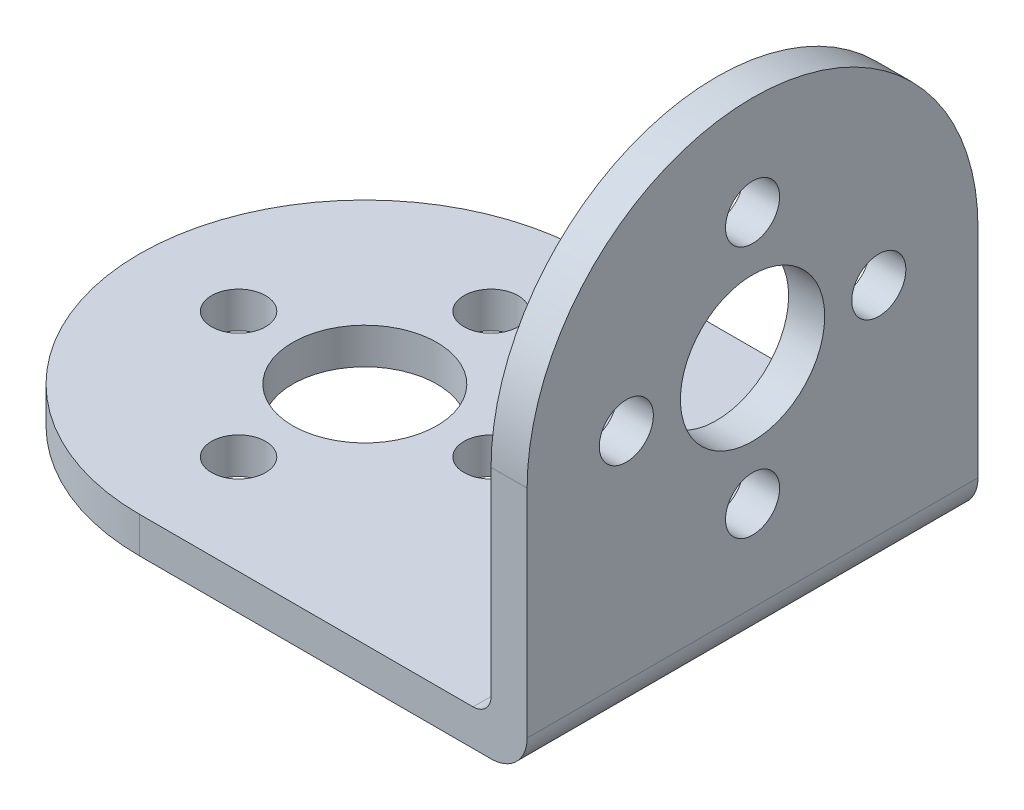
ISO-10303-21;
HEADER;
FILE_DESCRIPTION(('STEP AP214'),'2;1');
FILE_NAME('part.step','',(''),(''),'','','');
FILE_SCHEMA(('AUTOMOTIVE_DESIGN { 1 0 10303 214 1 1 1 1 }'));
ENDSEC;
DATA;
#1=APPLICATION_CONTEXT('core data for automotive mechanical design processes');
#2=APPLICATION_PROTOCOL_DEFINITION('international standard','automotive_design',2000,#1);
#3=PRODUCT_CONTEXT('',#1,'mechanical');
#4=PRODUCT('Part','Part','',(#3));
#5=PRODUCT_RELATED_PRODUCT_CATEGORY('part','',(#4));
#6=PRODUCT_DEFINITION_FORMATION('','',#4);
#7=PRODUCT_DEFINITION_CONTEXT('part definition',#1,'design');
#8=PRODUCT_DEFINITION('design','',#6,#7);
#9=PRODUCT_DEFINITION_SHAPE('','',#8);
#10=(LENGTH_UNIT() NAMED_UNIT(*) SI_UNIT(.MILLI.,.METRE.));
#11=(NAMED_UNIT(*) PLANE_ANGLE_UNIT() SI_UNIT($,.RADIAN.));
#12=(NAMED_UNIT(*) SI_UNIT($,.STERADIAN.) SOLID_ANGLE_UNIT());
#13=UNCERTAINTY_MEASURE_WITH_UNIT(LENGTH_MEASURE(1.E-05),#10,'distance_accuracy_value','');
#14=(GEOMETRIC_REPRESENTATION_CONTEXT(3) GLOBAL_UNCERTAINTY_ASSIGNED_CONTEXT((#13)) GLOBAL_UNIT_ASSIGNED_CONTEXT((#10,
#11,#12)) REPRESENTATION_CONTEXT('',''));
#15=CARTESIAN_POINT('',(0.,0.,0.));
#16=DIRECTION('',(0.,0.,1.));
#17=DIRECTION('',(1.,0.,0.));
#18=AXIS2_PLACEMENT_3D('',#15,#16,#17);
#19=CARTESIAN_POINT('',(-19.5,2.,0.));
#20=DIRECTION('',(0.,1.,0.));
#21=DIRECTION('',(0.,0.,1.));
#22=AXIS2_PLACEMENT_3D('',#19,#20,#21);
#23=PLANE('',#22);
#24=CARTESIAN_POINT('',(-12.5,2.,0.));
#25=DIRECTION('',(0.,1.,0.));
#26=DIRECTION('',(0.,0.,1.));
#27=AXIS2_PLACEMENT_3D('',#24,#25,#26);
#28=CIRCLE('',#27,1.5);
#29=CARTESIAN_POINT('',(-12.5,2.,1.50000000000001));
#30=VERTEX_POINT('',#29);
#31=EDGE_CURVE('E140',#30,#30,#28,.T.);
#32=ORIENTED_EDGE('',*,*,#31,.F.);
#33=EDGE_LOOP('',(#32));
#34=FACE_BOUND('',#33,.T.);
#35=CARTESIAN_POINT('',(-19.5,2.,-6.99999999999999));
#36=DIRECTION('',(0.,1.,0.));
#37=DIRECTION('',(0.,0.,1.));
#38=AXIS2_PLACEMENT_3D('',#35,#36,#37);
#39=CIRCLE('',#38,1.5);
#40=CARTESIAN_POINT('',(-19.5,2.,-5.49999999999999));
#41=VERTEX_POINT('',#40);
#42=EDGE_CURVE('E152',#41,#41,#39,.T.);
#43=ORIENTED_EDGE('',*,*,#42,.F.);
#44=EDGE_LOOP('',(#43));
#45=FACE_BOUND('',#44,.T.);
#46=DIRECTION('',(1.,0.,0.));
#47=VECTOR('',#46,1.);
#48=CARTESIAN_POINT('',(-19.5,2.,12.5));
#49=LINE('',#48,#47);
#50=CARTESIAN_POINT('',(-19.5,2.,12.5));
#51=VERTEX_POINT('',#50);
#52=CARTESIAN_POINT('',(-1.,2.,12.5));
#53=VERTEX_POINT('',#52);
#54=EDGE_CURVE('E167',#51,#53,#49,.T.);
#55=ORIENTED_EDGE('',*,*,#54,.T.);
#56=DIRECTION('',(0.,0.,-1.));
#57=VECTOR('',#56,1.);
#58=CARTESIAN_POINT('',(-1.,2.,-12.5));
#59=LINE('',#58,#57);
#60=CARTESIAN_POINT('',(-1.,2.,-12.5));
#61=VERTEX_POINT('',#60);
#62=EDGE_CURVE('E184',#53,#61,#59,.T.);
#63=ORIENTED_EDGE('',*,*,#62,.T.);
#64=DIRECTION('',(-1.,0.,0.));
#65=VECTOR('',#64,1.);
#66=CARTESIAN_POINT('',(-19.5,2.,-12.5));
#67=LINE('',#66,#65);
#68=CARTESIAN_POINT('',(-19.5,2.,-12.5));
#69=VERTEX_POINT('',#68);
#70=EDGE_CURVE('E171',#61,#69,#67,.T.);
#71=ORIENTED_EDGE('',*,*,#70,.T.);
#72=CARTESIAN_POINT('',(-19.5,2.,0.));
#73=DIRECTION('',(0.,1.,0.));
#74=DIRECTION('',(0.,0.,1.));
#75=AXIS2_PLACEMENT_3D('',#72,#73,#74);
#76=CIRCLE('',#75,12.5);
#77=EDGE_CURVE('E164',#69,#51,#76,.T.);
#78=ORIENTED_EDGE('',*,*,#77,.T.);
#79=EDGE_LOOP('',(#55,#63,#71,#78));
#80=FACE_BOUND('',#79,.T.);
#81=CARTESIAN_POINT('',(-19.5,2.,0.));
#82=DIRECTION('',(0.,1.,0.));
#83=DIRECTION('',(0.,0.,1.));
#84=AXIS2_PLACEMENT_3D('',#81,#82,#83);
#85=CIRCLE('',#84,4.);
#86=CARTESIAN_POINT('',(-19.5,2.,4.));
#87=VERTEX_POINT('',#86);
#88=EDGE_CURVE('E158',#87,#87,#85,.T.);
#89=ORIENTED_EDGE('',*,*,#88,.F.);
#90=EDGE_LOOP('',(#89));
#91=FACE_BOUND('',#90,.T.);
#92=CARTESIAN_POINT('',(-19.5,2.,7.00000000000001));
#93=DIRECTION('',(0.,1.,0.));
#94=DIRECTION('',(0.,0.,1.));
#95=AXIS2_PLACEMENT_3D('',#92,#93,#94);
#96=CIRCLE('',#95,1.5);
#97=CARTESIAN_POINT('',(-19.5,2.,8.50000000000001));
#98=VERTEX_POINT('',#97);
#99=EDGE_CURVE('E146',#98,#98,#96,.T.);
#100=ORIENTED_EDGE('',*,*,#99,.F.);
#101=EDGE_LOOP('',(#100));
#102=FACE_BOUND('',#101,.T.);
#103=CARTESIAN_POINT('',(-26.5,2.,0.));
#104=DIRECTION('',(0.,1.,0.));
#105=DIRECTION('',(0.,0.,1.));
#106=AXIS2_PLACEMENT_3D('',#103,#104,#105);
#107=CIRCLE('',#106,1.5);
#108=CARTESIAN_POINT('',(-26.5,2.,1.50000000000001));
#109=VERTEX_POINT('',#108);
#110=EDGE_CURVE('E134',#109,#109,#107,.T.);
#111=ORIENTED_EDGE('',*,*,#110,.F.);
#112=EDGE_LOOP('',(#111));
#113=FACE_BOUND('',#112,.T.);
#114=ADVANCED_FACE('F36',(#34,#45,#80,#91,#102,#113),#23,.T.);
#115=CARTESIAN_POINT('',(-19.5,0.,0.));
#116=DIRECTION('',(0.,1.,0.));
#117=DIRECTION('',(0.,0.,1.));
#118=AXIS2_PLACEMENT_3D('',#115,#116,#117);
#119=PLANE('',#118);
#120=DIRECTION('',(-1.,0.,0.));
#121=VECTOR('',#120,1.);
#122=CARTESIAN_POINT('',(-19.5,0.,-12.5));
#123=LINE('',#122,#121);
#124=CARTESIAN_POINT('',(0.,0.,-12.5));
#125=VERTEX_POINT('',#124);
#126=CARTESIAN_POINT('',(-19.5,0.,-12.5));
#127=VERTEX_POINT('',#126);
#128=EDGE_CURVE('E168',#125,#127,#123,.T.);
#129=ORIENTED_EDGE('',*,*,#128,.F.);
#130=DIRECTION('',(0.,0.,-1.));
#131=VECTOR('',#130,1.);
#132=CARTESIAN_POINT('',(0.,0.,0.));
#133=LINE('',#132,#131);
#134=CARTESIAN_POINT('',(0.,0.,12.5));
#135=VERTEX_POINT('',#134);
#136=EDGE_CURVE('E44',#125,#135,#133,.F.);
#137=ORIENTED_EDGE('',*,*,#136,.T.);
#138=DIRECTION('',(1.,0.,0.));
#139=VECTOR('',#138,1.);
#140=CARTESIAN_POINT('',(-19.5,0.,12.5));
#141=LINE('',#140,#139);
#142=CARTESIAN_POINT('',(-19.5,0.,12.5));
#143=VERTEX_POINT('',#142);
#144=EDGE_CURVE('E176',#143,#135,#141,.T.);
#145=ORIENTED_EDGE('',*,*,#144,.F.);
#146=CARTESIAN_POINT('',(-19.5,0.,0.));
#147=DIRECTION('',(0.,1.,0.));
#148=DIRECTION('',(0.,0.,1.));
#149=AXIS2_PLACEMENT_3D('',#146,#147,#148);
#150=CIRCLE('',#149,12.5);
#151=EDGE_CURVE('E161',#127,#143,#150,.T.);
#152=ORIENTED_EDGE('',*,*,#151,.F.);
#153=EDGE_LOOP('',(#129,#137,#145,#152));
#154=FACE_BOUND('',#153,.T.);
#155=CARTESIAN_POINT('',(-19.5,0.,0.));
#156=DIRECTION('',(0.,1.,0.));
#157=DIRECTION('',(0.,0.,1.));
#158=AXIS2_PLACEMENT_3D('',#155,#156,#157);
#159=CIRCLE('',#158,4.);
#160=CARTESIAN_POINT('',(-19.5,0.,4.));
#161=VERTEX_POINT('',#160);
#162=EDGE_CURVE('E155',#161,#161,#159,.T.);
#163=ORIENTED_EDGE('',*,*,#162,.T.);
#164=EDGE_LOOP('',(#163));
#165=FACE_BOUND('',#164,.T.);
#166=CARTESIAN_POINT('',(-19.5,0.,-6.99999999999999));
#167=DIRECTION('',(0.,1.,0.));
#168=DIRECTION('',(0.,0.,1.));
#169=AXIS2_PLACEMENT_3D('',#166,#167,#168);
#170=CIRCLE('',#169,1.5);
#171=CARTESIAN_POINT('',(-19.5,0.,-5.49999999999999));
#172=VERTEX_POINT('',#171);
#173=EDGE_CURVE('E149',#172,#172,#170,.T.);
#174=ORIENTED_EDGE('',*,*,#173,.T.);
#175=EDGE_LOOP('',(#174));
#176=FACE_BOUND('',#175,.T.);
#177=CARTESIAN_POINT('',(-19.5,0.,7.00000000000001));
#178=DIRECTION('',(0.,1.,0.));
#179=DIRECTION('',(0.,0.,1.));
#180=AXIS2_PLACEMENT_3D('',#177,#178,#179);
#181=CIRCLE('',#180,1.5);
#182=CARTESIAN_POINT('',(-19.5,0.,8.50000000000001));
#183=VERTEX_POINT('',#182);
#184=EDGE_CURVE('E143',#183,#183,#181,.T.);
#185=ORIENTED_EDGE('',*,*,#184,.T.);
#186=EDGE_LOOP('',(#185));
#187=FACE_BOUND('',#186,.T.);
#188=CARTESIAN_POINT('',(-12.5,0.,0.));
#189=DIRECTION('',(0.,1.,0.));
#190=DIRECTION('',(0.,0.,1.));
#191=AXIS2_PLACEMENT_3D('',#188,#189,#190);
#192=CIRCLE('',#191,1.5);
#193=CARTESIAN_POINT('',(-12.5,0.,1.50000000000001));
#194=VERTEX_POINT('',#193);
#195=EDGE_CURVE('E137',#194,#194,#192,.T.);
#196=ORIENTED_EDGE('',*,*,#195,.T.);
#197=EDGE_LOOP('',(#196));
#198=FACE_BOUND('',#197,.T.);
#199=CARTESIAN_POINT('',(-26.5,0.,0.));
#200=DIRECTION('',(0.,1.,0.));
#201=DIRECTION('',(0.,0.,1.));
#202=AXIS2_PLACEMENT_3D('',#199,#200,#201);
#203=CIRCLE('',#202,1.5);
#204=CARTESIAN_POINT('',(-26.5,0.,1.50000000000001));
#205=VERTEX_POINT('',#204);
#206=EDGE_CURVE('E117',#205,#205,#203,.T.);
#207=ORIENTED_EDGE('',*,*,#206,.T.);
#208=EDGE_LOOP('',(#207));
#209=FACE_BOUND('',#208,.T.);
#210=ADVANCED_FACE('F258',(#154,#165,#176,#187,#198,#209),#119,.F.);
#211=CARTESIAN_POINT('',(-19.5,2.,0.));
#212=DIRECTION('',(0.,-1.,0.));
#213=DIRECTION('',(0.,0.,-1.));
#214=AXIS2_PLACEMENT_3D('',#211,#212,#213);
#215=CYLINDRICAL_SURFACE('',#214,12.5);
#216=ORIENTED_EDGE('',*,*,#151,.T.);
#217=DIRECTION('',(0.,-1.,0.));
#218=VECTOR('',#217,1.);
#219=CARTESIAN_POINT('',(-19.5,2.,12.5));
#220=LINE('',#219,#218);
#221=EDGE_CURVE('E181',#51,#143,#220,.T.);
#222=ORIENTED_EDGE('',*,*,#221,.F.);
#223=ORIENTED_EDGE('',*,*,#77,.F.);
#224=DIRECTION('',(0.,-1.,0.));
#225=VECTOR('',#224,1.);
#226=CARTESIAN_POINT('',(-19.5,2.,-12.5));
#227=LINE('',#226,#225);
#228=EDGE_CURVE('E173',#69,#127,#227,.T.);
#229=ORIENTED_EDGE('',*,*,#228,.T.);
#230=EDGE_LOOP('',(#216,#222,#223,#229));
#231=FACE_BOUND('',#230,.T.);
#232=ADVANCED_FACE('F264',(#231),#215,.T.);
#233=CARTESIAN_POINT('',(-19.5,2.,12.5));
#234=DIRECTION('',(0.,0.,-1.));
#235=DIRECTION('',(-1.,0.,0.));
#236=AXIS2_PLACEMENT_3D('',#233,#234,#235);
#237=PLANE('',#236);
#238=ORIENTED_EDGE('',*,*,#144,.T.);
#239=CARTESIAN_POINT('',(0.,2.,12.5));
#240=DIRECTION('',(0.,0.,-1.));
#241=DIRECTION('',(-1.,0.,0.));
#242=AXIS2_PLACEMENT_3D('',#239,#240,#241);
#243=CIRCLE('',#242,2.);
#244=CARTESIAN_POINT('',(2.,2.,12.5));
#245=VERTEX_POINT('',#244);
#246=EDGE_CURVE('E11',#135,#245,#243,.F.);
#247=ORIENTED_EDGE('',*,*,#246,.T.);
#248=DIRECTION('',(0.,-1.,0.));
#249=VECTOR('',#248,1.);
#250=CARTESIAN_POINT('',(2.,0.,12.5));
#251=LINE('',#250,#249);
#252=CARTESIAN_POINT('',(2.,14.,12.5));
#253=VERTEX_POINT('',#252);
#254=EDGE_CURVE('E108',#253,#245,#251,.T.);
#255=ORIENTED_EDGE('',*,*,#254,.F.);
#256=DIRECTION('',(-1.,0.,0.));
#257=VECTOR('',#256,1.);
#258=CARTESIAN_POINT('',(2.,14.,12.5));
#259=LINE('',#258,#257);
#260=CARTESIAN_POINT('',(0.,14.,12.5));
#261=VERTEX_POINT('',#260);
#262=EDGE_CURVE('E118',#253,#261,#259,.T.);
#263=ORIENTED_EDGE('',*,*,#262,.T.);
#264=DIRECTION('',(0.,-1.,0.));
#265=VECTOR('',#264,1.);
#266=CARTESIAN_POINT('',(0.,0.,12.5));
#267=LINE('',#266,#265);
#268=CARTESIAN_POINT('',(0.,3.,12.5));
#269=VERTEX_POINT('',#268);
#270=EDGE_CURVE('E127',#261,#269,#267,.T.);
#271=ORIENTED_EDGE('',*,*,#270,.T.);
#272=CARTESIAN_POINT('',(-1.,3.,12.5));
#273=DIRECTION('',(0.,0.,-1.));
#274=DIRECTION('',(-1.,0.,0.));
#275=AXIS2_PLACEMENT_3D('',#272,#273,#274);
#276=CIRCLE('',#275,1.);
#277=EDGE_CURVE('E191',#269,#53,#276,.T.);
#278=ORIENTED_EDGE('',*,*,#277,.T.);
#279=ORIENTED_EDGE('',*,*,#54,.F.);
#280=ORIENTED_EDGE('',*,*,#221,.T.);
#281=EDGE_LOOP('',(#238,#247,#255,#263,#271,#278,#279,#280));
#282=FACE_BOUND('',#281,.T.);
#283=ADVANCED_FACE('F196',(#282),#237,.F.);
#284=CARTESIAN_POINT('',(-19.5,2.,-12.5));
#285=DIRECTION('',(0.,0.,1.));
#286=DIRECTION('',(1.,0.,0.));
#287=AXIS2_PLACEMENT_3D('',#284,#285,#286);
#288=PLANE('',#287);
#289=DIRECTION('',(0.,1.,0.));
#290=VECTOR('',#289,1.);
#291=CARTESIAN_POINT('',(2.,0.,-12.5));
#292=LINE('',#291,#290);
#293=CARTESIAN_POINT('',(2.,2.,-12.5));
#294=VERTEX_POINT('',#293);
#295=CARTESIAN_POINT('',(2.,14.,-12.5));
#296=VERTEX_POINT('',#295);
#297=EDGE_CURVE('E98',#294,#296,#292,.T.);
#298=ORIENTED_EDGE('',*,*,#297,.F.);
#299=CARTESIAN_POINT('',(0.,2.,-12.5));
#300=DIRECTION('',(0.,0.,1.));
#301=DIRECTION('',(1.,0.,0.));
#302=AXIS2_PLACEMENT_3D('',#299,#300,#301);
#303=CIRCLE('',#302,2.);
#304=EDGE_CURVE('E58',#294,#125,#303,.F.);
#305=ORIENTED_EDGE('',*,*,#304,.T.);
#306=ORIENTED_EDGE('',*,*,#128,.T.);
#307=ORIENTED_EDGE('',*,*,#228,.F.);
#308=ORIENTED_EDGE('',*,*,#70,.F.);
#309=CARTESIAN_POINT('',(-1.,3.,-12.5));
#310=DIRECTION('',(0.,0.,1.));
#311=DIRECTION('',(1.,0.,0.));
#312=AXIS2_PLACEMENT_3D('',#309,#310,#311);
#313=CIRCLE('',#312,1.);
#314=CARTESIAN_POINT('',(0.,3.,-12.5));
#315=VERTEX_POINT('',#314);
#316=EDGE_CURVE('E189',#61,#315,#313,.T.);
#317=ORIENTED_EDGE('',*,*,#316,.T.);
#318=DIRECTION('',(0.,1.,0.));
#319=VECTOR('',#318,1.);
#320=CARTESIAN_POINT('',(0.,0.,-12.5));
#321=LINE('',#320,#319);
#322=CARTESIAN_POINT('',(0.,14.,-12.5));
#323=VERTEX_POINT('',#322);
#324=EDGE_CURVE('E114',#315,#323,#321,.T.);
#325=ORIENTED_EDGE('',*,*,#324,.T.);
#326=DIRECTION('',(-1.,0.,0.));
#327=VECTOR('',#326,1.);
#328=CARTESIAN_POINT('',(2.,14.,-12.5));
#329=LINE('',#328,#327);
#330=EDGE_CURVE('E111',#296,#323,#329,.T.);
#331=ORIENTED_EDGE('',*,*,#330,.F.);
#332=EDGE_LOOP('',(#298,#305,#306,#307,#308,#317,#325,#331));
#333=FACE_BOUND('',#332,.T.);
#334=ADVANCED_FACE('F112',(#333),#288,.F.);
#335=CARTESIAN_POINT('',(-19.5,2.,0.));
#336=DIRECTION('',(0.,-1.,0.));
#337=DIRECTION('',(0.,0.,-1.));
#338=AXIS2_PLACEMENT_3D('',#335,#336,#337);
#339=CYLINDRICAL_SURFACE('',#338,4.);
#340=ORIENTED_EDGE('',*,*,#88,.T.);
#341=EDGE_LOOP('',(#340));
#342=FACE_BOUND('',#341,.T.);
#343=ORIENTED_EDGE('',*,*,#162,.F.);
#344=EDGE_LOOP('',(#343));
#345=FACE_BOUND('',#344,.T.);
#346=ADVANCED_FACE('F269',(#342,#345),#339,.F.);
#347=CARTESIAN_POINT('',(-19.5,2.,-6.99999999999999));
#348=DIRECTION('',(0.,-1.,0.));
#349=DIRECTION('',(0.,0.,-1.));
#350=AXIS2_PLACEMENT_3D('',#347,#348,#349);
#351=CYLINDRICAL_SURFACE('',#350,1.5);
#352=ORIENTED_EDGE('',*,*,#42,.T.);
#353=EDGE_LOOP('',(#352));
#354=FACE_BOUND('',#353,.T.);
#355=ORIENTED_EDGE('',*,*,#173,.F.);
#356=EDGE_LOOP('',(#355));
#357=FACE_BOUND('',#356,.T.);
#358=ADVANCED_FACE('F425',(#354,#357),#351,.F.);
#359=CARTESIAN_POINT('',(-19.5,2.,7.00000000000001));
#360=DIRECTION('',(0.,-1.,0.));
#361=DIRECTION('',(0.,0.,-1.));
#362=AXIS2_PLACEMENT_3D('',#359,#360,#361);
#363=CYLINDRICAL_SURFACE('',#362,1.5);
#364=ORIENTED_EDGE('',*,*,#99,.T.);
#365=EDGE_LOOP('',(#364));
#366=FACE_BOUND('',#365,.T.);
#367=ORIENTED_EDGE('',*,*,#184,.F.);
#368=EDGE_LOOP('',(#367));
#369=FACE_BOUND('',#368,.T.);
#370=ADVANCED_FACE('F415',(#366,#369),#363,.F.);
#371=CARTESIAN_POINT('',(-12.5,2.,0.));
#372=DIRECTION('',(0.,-1.,0.));
#373=DIRECTION('',(0.,0.,-1.));
#374=AXIS2_PLACEMENT_3D('',#371,#372,#373);
#375=CYLINDRICAL_SURFACE('',#374,1.5);
#376=ORIENTED_EDGE('',*,*,#31,.T.);
#377=EDGE_LOOP('',(#376));
#378=FACE_BOUND('',#377,.T.);
#379=ORIENTED_EDGE('',*,*,#195,.F.);
#380=EDGE_LOOP('',(#379));
#381=FACE_BOUND('',#380,.T.);
#382=ADVANCED_FACE('F405',(#378,#381),#375,.F.);
#383=CARTESIAN_POINT('',(-26.5,2.,0.));
#384=DIRECTION('',(0.,-1.,0.));
#385=DIRECTION('',(0.,0.,-1.));
#386=AXIS2_PLACEMENT_3D('',#383,#384,#385);
#387=CYLINDRICAL_SURFACE('',#386,1.5);
#388=ORIENTED_EDGE('',*,*,#110,.T.);
#389=EDGE_LOOP('',(#388));
#390=FACE_BOUND('',#389,.T.);
#391=ORIENTED_EDGE('',*,*,#206,.F.);
#392=EDGE_LOOP('',(#391));
#393=FACE_BOUND('',#392,.T.);
#394=ADVANCED_FACE('F253',(#390,#393),#387,.F.);
#395=CARTESIAN_POINT('',(0.,14.,0.));
#396=DIRECTION('',(-1.,0.,0.));
#397=DIRECTION('',(0.,0.,1.));
#398=AXIS2_PLACEMENT_3D('',#395,#396,#397);
#399=PLANE('',#398);
#400=CARTESIAN_POINT('',(0.,14.,7.));
#401=DIRECTION('',(1.,0.,0.));
#402=DIRECTION('',(0.,0.,-1.));
#403=AXIS2_PLACEMENT_3D('',#400,#401,#402);
#404=CIRCLE('',#403,1.5);
#405=CARTESIAN_POINT('',(0.,14.,5.5));
#406=VERTEX_POINT('',#405);
#407=EDGE_CURVE('E236',#406,#406,#404,.T.);
#408=ORIENTED_EDGE('',*,*,#407,.T.);
#409=EDGE_LOOP('',(#408));
#410=FACE_BOUND('',#409,.T.);
#411=CARTESIAN_POINT('',(0.,14.,-7.));
#412=DIRECTION('',(1.,0.,0.));
#413=DIRECTION('',(0.,0.,-1.));
#414=AXIS2_PLACEMENT_3D('',#411,#412,#413);
#415=CIRCLE('',#414,1.5);
#416=CARTESIAN_POINT('',(0.,14.,-8.5));
#417=VERTEX_POINT('',#416);
#418=EDGE_CURVE('E224',#417,#417,#415,.T.);
#419=ORIENTED_EDGE('',*,*,#418,.T.);
#420=EDGE_LOOP('',(#419));
#421=FACE_BOUND('',#420,.T.);
#422=CARTESIAN_POINT('',(0.,14.,0.));
#423=DIRECTION('',(1.,0.,0.));
#424=DIRECTION('',(0.,0.,-1.));
#425=AXIS2_PLACEMENT_3D('',#422,#423,#424);
#426=CIRCLE('',#425,4.);
#427=CARTESIAN_POINT('',(0.,14.,-4.));
#428=VERTEX_POINT('',#427);
#429=EDGE_CURVE('E212',#428,#428,#426,.T.);
#430=ORIENTED_EDGE('',*,*,#429,.T.);
#431=EDGE_LOOP('',(#430));
#432=FACE_BOUND('',#431,.T.);
#433=CARTESIAN_POINT('',(0.,21.,0.));
#434=DIRECTION('',(1.,0.,0.));
#435=DIRECTION('',(0.,0.,-1.));
#436=AXIS2_PLACEMENT_3D('',#433,#434,#435);
#437=CIRCLE('',#436,1.5);
#438=CARTESIAN_POINT('',(0.,21.,-1.5));
#439=VERTEX_POINT('',#438);
#440=EDGE_CURVE('E218',#439,#439,#437,.T.);
#441=ORIENTED_EDGE('',*,*,#440,.T.);
#442=EDGE_LOOP('',(#441));
#443=FACE_BOUND('',#442,.T.);
#444=CARTESIAN_POINT('',(0.,7.,0.));
#445=DIRECTION('',(1.,0.,0.));
#446=DIRECTION('',(0.,0.,-1.));
#447=AXIS2_PLACEMENT_3D('',#444,#445,#446);
#448=CIRCLE('',#447,1.5);
#449=CARTESIAN_POINT('',(0.,7.,-1.5));
#450=VERTEX_POINT('',#449);
#451=EDGE_CURVE('E230',#450,#450,#448,.T.);
#452=ORIENTED_EDGE('',*,*,#451,.T.);
#453=EDGE_LOOP('',(#452));
#454=FACE_BOUND('',#453,.T.);
#455=ORIENTED_EDGE('',*,*,#324,.F.);
#456=DIRECTION('',(0.,0.,-1.));
#457=VECTOR('',#456,1.);
#458=CARTESIAN_POINT('',(0.,3.,12.5));
#459=LINE('',#458,#457);
#460=EDGE_CURVE('E187',#315,#269,#459,.F.);
#461=ORIENTED_EDGE('',*,*,#460,.T.);
#462=ORIENTED_EDGE('',*,*,#270,.F.);
#463=CARTESIAN_POINT('',(0.,14.,0.));
#464=DIRECTION('',(1.,0.,0.));
#465=DIRECTION('',(0.,0.,1.));
#466=AXIS2_PLACEMENT_3D('',#463,#464,#465);
#467=CIRCLE('',#466,12.5);
#468=EDGE_CURVE('E132',#323,#261,#467,.T.);
#469=ORIENTED_EDGE('',*,*,#468,.F.);
#470=EDGE_LOOP('',(#455,#461,#462,#469));
#471=FACE_BOUND('',#470,.T.);
#472=ADVANCED_FACE('F209',(#410,#421,#432,#443,#454,#471),#399,.T.);
#473=CARTESIAN_POINT('',(2.,14.,0.));
#474=DIRECTION('',(-1.,0.,0.));
#475=DIRECTION('',(0.,0.,1.));
#476=AXIS2_PLACEMENT_3D('',#473,#474,#475);
#477=PLANE('',#476);
#478=ORIENTED_EDGE('',*,*,#254,.T.);
#479=DIRECTION('',(0.,0.,-1.));
#480=VECTOR('',#479,1.);
#481=CARTESIAN_POINT('',(2.,2.,0.));
#482=LINE('',#481,#480);
#483=EDGE_CURVE('E107',#245,#294,#482,.T.);
#484=ORIENTED_EDGE('',*,*,#483,.T.);
#485=ORIENTED_EDGE('',*,*,#297,.T.);
#486=CARTESIAN_POINT('',(2.,14.,0.));
#487=DIRECTION('',(1.,0.,0.));
#488=DIRECTION('',(0.,0.,1.));
#489=AXIS2_PLACEMENT_3D('',#486,#487,#488);
#490=CIRCLE('',#489,12.5);
#491=EDGE_CURVE('E104',#296,#253,#490,.T.);
#492=ORIENTED_EDGE('',*,*,#491,.T.);
#493=EDGE_LOOP('',(#478,#484,#485,#492));
#494=FACE_BOUND('',#493,.T.);
#495=CARTESIAN_POINT('',(2.,14.,0.));
#496=DIRECTION('',(1.,0.,0.));
#497=DIRECTION('',(0.,0.,-1.));
#498=AXIS2_PLACEMENT_3D('',#495,#496,#497);
#499=CIRCLE('',#498,4.);
#500=CARTESIAN_POINT('',(2.,14.,-4.));
#501=VERTEX_POINT('',#500);
#502=EDGE_CURVE('E130',#501,#501,#499,.T.);
#503=ORIENTED_EDGE('',*,*,#502,.F.);
#504=EDGE_LOOP('',(#503));
#505=FACE_BOUND('',#504,.T.);
#506=CARTESIAN_POINT('',(2.,21.,0.));
#507=DIRECTION('',(1.,0.,0.));
#508=DIRECTION('',(0.,0.,-1.));
#509=AXIS2_PLACEMENT_3D('',#506,#507,#508);
#510=CIRCLE('',#509,1.5);
#511=CARTESIAN_POINT('',(2.,21.,-1.5));
#512=VERTEX_POINT('',#511);
#513=EDGE_CURVE('E215',#512,#512,#510,.T.);
#514=ORIENTED_EDGE('',*,*,#513,.F.);
#515=EDGE_LOOP('',(#514));
#516=FACE_BOUND('',#515,.T.);
#517=CARTESIAN_POINT('',(2.,14.,-7.));
#518=DIRECTION('',(1.,0.,0.));
#519=DIRECTION('',(0.,0.,-1.));
#520=AXIS2_PLACEMENT_3D('',#517,#518,#519);
#521=CIRCLE('',#520,1.5);
#522=CARTESIAN_POINT('',(2.,14.,-8.5));
#523=VERTEX_POINT('',#522);
#524=EDGE_CURVE('E221',#523,#523,#521,.T.);
#525=ORIENTED_EDGE('',*,*,#524,.F.);
#526=EDGE_LOOP('',(#525));
#527=FACE_BOUND('',#526,.T.);
#528=CARTESIAN_POINT('',(2.,7.,0.));
#529=DIRECTION('',(1.,0.,0.));
#530=DIRECTION('',(0.,0.,-1.));
#531=AXIS2_PLACEMENT_3D('',#528,#529,#530);
#532=CIRCLE('',#531,1.5);
#533=CARTESIAN_POINT('',(2.,7.,-1.5));
#534=VERTEX_POINT('',#533);
#535=EDGE_CURVE('E227',#534,#534,#532,.T.);
#536=ORIENTED_EDGE('',*,*,#535,.F.);
#537=EDGE_LOOP('',(#536));
#538=FACE_BOUND('',#537,.T.);
#539=CARTESIAN_POINT('',(2.,14.,7.));
#540=DIRECTION('',(1.,0.,0.));
#541=DIRECTION('',(0.,0.,-1.));
#542=AXIS2_PLACEMENT_3D('',#539,#540,#541);
#543=CIRCLE('',#542,1.5);
#544=CARTESIAN_POINT('',(2.,14.,5.5));
#545=VERTEX_POINT('',#544);
#546=EDGE_CURVE('E233',#545,#545,#543,.T.);
#547=ORIENTED_EDGE('',*,*,#546,.F.);
#548=EDGE_LOOP('',(#547));
#549=FACE_BOUND('',#548,.T.);
#550=ADVANCED_FACE('F101',(#494,#505,#516,#527,#538,#549),#477,.F.);
#551=CARTESIAN_POINT('',(2.,14.,0.));
#552=DIRECTION('',(-1.,0.,0.));
#553=DIRECTION('',(0.,0.,1.));
#554=AXIS2_PLACEMENT_3D('',#551,#552,#553);
#555=CYLINDRICAL_SURFACE('',#554,12.5);
#556=ORIENTED_EDGE('',*,*,#468,.T.);
#557=ORIENTED_EDGE('',*,*,#262,.F.);
#558=ORIENTED_EDGE('',*,*,#491,.F.);
#559=ORIENTED_EDGE('',*,*,#330,.T.);
#560=EDGE_LOOP('',(#556,#557,#558,#559));
#561=FACE_BOUND('',#560,.T.);
#562=ADVANCED_FACE('F120',(#561),#555,.T.);
#563=CARTESIAN_POINT('',(2.,14.,0.));
#564=DIRECTION('',(-1.,0.,0.));
#565=DIRECTION('',(0.,0.,1.));
#566=AXIS2_PLACEMENT_3D('',#563,#564,#565);
#567=CYLINDRICAL_SURFACE('',#566,4.);
#568=ORIENTED_EDGE('',*,*,#502,.T.);
#569=EDGE_LOOP('',(#568));
#570=FACE_BOUND('',#569,.T.);
#571=ORIENTED_EDGE('',*,*,#429,.F.);
#572=EDGE_LOOP('',(#571));
#573=FACE_BOUND('',#572,.T.);
#574=ADVANCED_FACE('F251',(#570,#573),#567,.F.);
#575=CARTESIAN_POINT('',(2.,21.,0.));
#576=DIRECTION('',(-1.,0.,0.));
#577=DIRECTION('',(0.,0.,1.));
#578=AXIS2_PLACEMENT_3D('',#575,#576,#577);
#579=CYLINDRICAL_SURFACE('',#578,1.5);
#580=ORIENTED_EDGE('',*,*,#513,.T.);
#581=EDGE_LOOP('',(#580));
#582=FACE_BOUND('',#581,.T.);
#583=ORIENTED_EDGE('',*,*,#440,.F.);
#584=EDGE_LOOP('',(#583));
#585=FACE_BOUND('',#584,.T.);
#586=ADVANCED_FACE('F295',(#582,#585),#579,.F.);
#587=CARTESIAN_POINT('',(2.,14.,-7.));
#588=DIRECTION('',(-1.,0.,0.));
#589=DIRECTION('',(0.,0.,1.));
#590=AXIS2_PLACEMENT_3D('',#587,#588,#589);
#591=CYLINDRICAL_SURFACE('',#590,1.5);
#592=ORIENTED_EDGE('',*,*,#524,.T.);
#593=EDGE_LOOP('',(#592));
#594=FACE_BOUND('',#593,.T.);
#595=ORIENTED_EDGE('',*,*,#418,.F.);
#596=EDGE_LOOP('',(#595));
#597=FACE_BOUND('',#596,.T.);
#598=ADVANCED_FACE('F289',(#594,#597),#591,.F.);
#599=CARTESIAN_POINT('',(2.,7.,0.));
#600=DIRECTION('',(-1.,0.,0.));
#601=DIRECTION('',(0.,0.,1.));
#602=AXIS2_PLACEMENT_3D('',#599,#600,#601);
#603=CYLINDRICAL_SURFACE('',#602,1.5);
#604=ORIENTED_EDGE('',*,*,#535,.T.);
#605=EDGE_LOOP('',(#604));
#606=FACE_BOUND('',#605,.T.);
#607=ORIENTED_EDGE('',*,*,#451,.F.);
#608=EDGE_LOOP('',(#607));
#609=FACE_BOUND('',#608,.T.);
#610=ADVANCED_FACE('F284',(#606,#609),#603,.F.);
#611=CARTESIAN_POINT('',(2.,14.,7.));
#612=DIRECTION('',(-1.,0.,0.));
#613=DIRECTION('',(0.,0.,1.));
#614=AXIS2_PLACEMENT_3D('',#611,#612,#613);
#615=CYLINDRICAL_SURFACE('',#614,1.5);
#616=ORIENTED_EDGE('',*,*,#546,.T.);
#617=EDGE_LOOP('',(#616));
#618=FACE_BOUND('',#617,.T.);
#619=ORIENTED_EDGE('',*,*,#407,.F.);
#620=EDGE_LOOP('',(#619));
#621=FACE_BOUND('',#620,.T.);
#622=ADVANCED_FACE('F242',(#618,#621),#615,.F.);
#623=CARTESIAN_POINT('',(-1.,3.,0.));
#624=DIRECTION('',(0.,0.,1.));
#625=DIRECTION('',(1.,0.,0.));
#626=AXIS2_PLACEMENT_3D('',#623,#624,#625);
#627=CYLINDRICAL_SURFACE('',#626,1.);
#628=ORIENTED_EDGE('',*,*,#277,.F.);
#629=ORIENTED_EDGE('',*,*,#460,.F.);
#630=ORIENTED_EDGE('',*,*,#316,.F.);
#631=ORIENTED_EDGE('',*,*,#62,.F.);
#632=EDGE_LOOP('',(#628,#629,#630,#631));
#633=FACE_BOUND('',#632,.T.);
#634=ADVANCED_FACE('F206',(#633),#627,.F.);
#635=CARTESIAN_POINT('',(0.,2.,0.));
#636=DIRECTION('',(0.,0.,-1.));
#637=DIRECTION('',(-1.,0.,0.));
#638=AXIS2_PLACEMENT_3D('',#635,#636,#637);
#639=CYLINDRICAL_SURFACE('',#638,2.);
#640=ORIENTED_EDGE('',*,*,#246,.F.);
#641=ORIENTED_EDGE('',*,*,#136,.F.);
#642=ORIENTED_EDGE('',*,*,#304,.F.);
#643=ORIENTED_EDGE('',*,*,#483,.F.);
#644=EDGE_LOOP('',(#640,#641,#642,#643));
#645=FACE_BOUND('',#644,.T.);
#646=ADVANCED_FACE('F38',(#645),#639,.T.);
#647=CLOSED_SHELL('',(#114,#210,#232,#283,#334,#346,#358,#370,#382,#394,#472,#550,#562,#574,
#586,#598,#610,#622,#634,#646));
#648=MANIFOLD_SOLID_BREP('B2',#647);
#649=ADVANCED_BREP_SHAPE_REPRESENTATION('',(#18,#648),#14);
#650=SHAPE_DEFINITION_REPRESENTATION(#9,#649);
ENDSEC;
END-ISO-10303-21;
